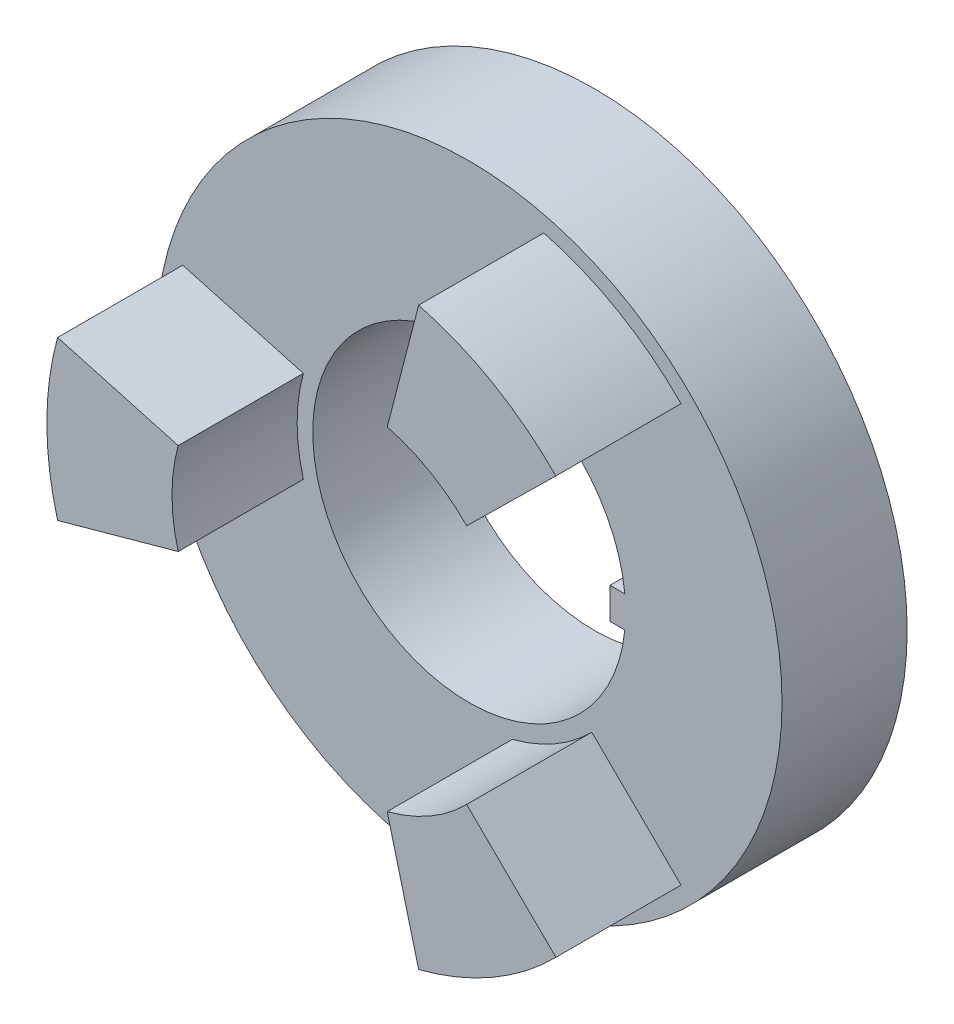
ISO-10303-21;
HEADER;
FILE_DESCRIPTION(('STEP AP214'),'2;1');
FILE_NAME('part.step','',(''),(''),'','','');
FILE_SCHEMA(('AUTOMOTIVE_DESIGN { 1 0 10303 214 1 1 1 1 }'));
ENDSEC;
DATA;
#1=APPLICATION_CONTEXT('core data for automotive mechanical design processes');
#2=APPLICATION_PROTOCOL_DEFINITION('international standard','automotive_design',2000,#1);
#3=PRODUCT_CONTEXT('',#1,'mechanical');
#4=PRODUCT('Part','Part','',(#3));
#5=PRODUCT_RELATED_PRODUCT_CATEGORY('part','',(#4));
#6=PRODUCT_DEFINITION_FORMATION('','',#4);
#7=PRODUCT_DEFINITION_CONTEXT('part definition',#1,'design');
#8=PRODUCT_DEFINITION('design','',#6,#7);
#9=PRODUCT_DEFINITION_SHAPE('','',#8);
#10=(LENGTH_UNIT() NAMED_UNIT(*) SI_UNIT(.MILLI.,.METRE.));
#11=(NAMED_UNIT(*) PLANE_ANGLE_UNIT() SI_UNIT($,.RADIAN.));
#12=(NAMED_UNIT(*) SI_UNIT($,.STERADIAN.) SOLID_ANGLE_UNIT());
#13=UNCERTAINTY_MEASURE_WITH_UNIT(LENGTH_MEASURE(1.E-05),#10,'distance_accuracy_value','');
#14=(GEOMETRIC_REPRESENTATION_CONTEXT(3) GLOBAL_UNCERTAINTY_ASSIGNED_CONTEXT((#13)) GLOBAL_UNIT_ASSIGNED_CONTEXT((#10,
#11,#12)) REPRESENTATION_CONTEXT('',''));
#15=CARTESIAN_POINT('',(0.,0.,0.));
#16=DIRECTION('',(0.,0.,1.));
#17=DIRECTION('',(1.,0.,0.));
#18=AXIS2_PLACEMENT_3D('',#15,#16,#17);
#19=CARTESIAN_POINT('',(0.,0.,4.));
#20=DIRECTION('',(0.,0.,1.));
#21=DIRECTION('',(1.,0.,0.));
#22=AXIS2_PLACEMENT_3D('',#19,#20,#21);
#23=PLANE('',#22);
#24=DIRECTION('',(-1.,0.,0.));
#25=VECTOR('',#24,1.);
#26=CARTESIAN_POINT('',(5.5,-0.499999999999999,4.));
#27=LINE('',#26,#25);
#28=CARTESIAN_POINT('',(4.9749371855331,-0.499999999999999,4.));
#29=VERTEX_POINT('',#28);
#30=CARTESIAN_POINT('',(4.5,-0.499999999999999,4.));
#31=VERTEX_POINT('',#30);
#32=EDGE_CURVE('E156',#29,#31,#27,.T.);
#33=ORIENTED_EDGE('',*,*,#32,.F.);
#34=CARTESIAN_POINT('',(0.,0.,4.));
#35=DIRECTION('',(0.,0.,1.));
#36=DIRECTION('',(1.,0.,0.));
#37=AXIS2_PLACEMENT_3D('',#34,#35,#36);
#38=CIRCLE('',#37,5.);
#39=CARTESIAN_POINT('',(4.9749371855331,0.500000000000001,4.));
#40=VERTEX_POINT('',#39);
#41=EDGE_CURVE('E164',#40,#29,#38,.T.);
#42=ORIENTED_EDGE('',*,*,#41,.F.);
#43=DIRECTION('',(1.,0.,0.));
#44=VECTOR('',#43,1.);
#45=CARTESIAN_POINT('',(5.5,0.500000000000001,4.));
#46=LINE('',#45,#44);
#47=CARTESIAN_POINT('',(4.5,0.500000000000001,4.));
#48=VERTEX_POINT('',#47);
#49=EDGE_CURVE('E150',#48,#40,#46,.T.);
#50=ORIENTED_EDGE('',*,*,#49,.F.);
#51=DIRECTION('',(0.,1.,0.));
#52=VECTOR('',#51,1.);
#53=CARTESIAN_POINT('',(4.5,0.500000000000001,4.));
#54=LINE('',#53,#52);
#55=EDGE_CURVE('E162',#31,#48,#54,.T.);
#56=ORIENTED_EDGE('',*,*,#55,.F.);
#57=EDGE_LOOP('',(#33,#42,#50,#56));
#58=FACE_BOUND('',#57,.T.);
#59=CARTESIAN_POINT('',(0.,0.,4.));
#60=DIRECTION('',(0.,0.,1.));
#61=DIRECTION('',(1.,0.,0.));
#62=AXIS2_PLACEMENT_3D('',#59,#60,#61);
#63=CIRCLE('',#62,5.5);
#64=CARTESIAN_POINT('',(3.92058984626385,3.85732747603526,4.));
#65=VERTEX_POINT('',#64);
#66=CARTESIAN_POINT('',(1.3802486618295,5.32399414270192,4.));
#67=VERTEX_POINT('',#66);
#68=EDGE_CURVE('E177',#65,#67,#63,.T.);
#69=ORIENTED_EDGE('',*,*,#68,.T.);
#70=DIRECTION('',(0.250954302150848,0.967998935036594,0.));
#71=VECTOR('',#70,1.);
#72=CARTESIAN_POINT('',(-3.16741076286094E-13,0.,4.));
#73=LINE('',#72,#71);
#74=CARTESIAN_POINT('',(2.38406587043289,9.1959898828483,4.));
#75=VERTEX_POINT('',#74);
#76=EDGE_CURVE('E183',#67,#75,#73,.T.);
#77=ORIENTED_EDGE('',*,*,#76,.T.);
#78=CARTESIAN_POINT('',(0.,0.,4.));
#79=DIRECTION('',(0.,0.,1.));
#80=DIRECTION('',(1.,0.,0.));
#81=AXIS2_PLACEMENT_3D('',#78,#79,#80);
#82=CIRCLE('',#81,9.5);
#83=CARTESIAN_POINT('',(6.7719279162738,6.66265654951473,4.));
#84=VERTEX_POINT('',#83);
#85=EDGE_CURVE('E193',#84,#75,#82,.T.);
#86=ORIENTED_EDGE('',*,*,#85,.F.);
#87=DIRECTION('',(0.712834517502549,0.701332268369928,0.));
#88=VECTOR('',#87,1.);
#89=CARTESIAN_POINT('',(-4.08479342547263E-13,4.1517863669842E-13,4.));
#90=LINE('',#89,#88);
#91=EDGE_CURVE('E58',#65,#84,#90,.T.);
#92=ORIENTED_EDGE('',*,*,#91,.F.);
#93=EDGE_LOOP('',(#69,#77,#86,#92));
#94=FACE_BOUND('',#93,.T.);
#95=CARTESIAN_POINT('',(0.,0.,4.));
#96=DIRECTION('',(0.,0.,1.));
#97=DIRECTION('',(1.,0.,0.));
#98=AXIS2_PLACEMENT_3D('',#95,#96,#97);
#99=CIRCLE('',#98,5.5);
#100=CARTESIAN_POINT('',(1.38024866183015,-5.3239941427008,4.));
#101=VERTEX_POINT('',#100);
#102=CARTESIAN_POINT('',(3.9205898462645,-3.85732747603413,4.));
#103=VERTEX_POINT('',#102);
#104=EDGE_CURVE('E207',#101,#103,#99,.T.);
#105=ORIENTED_EDGE('',*,*,#104,.T.);
#106=DIRECTION('',(0.712834517502549,-0.701332268369927,0.));
#107=VECTOR('',#106,1.);
#108=CARTESIAN_POINT('',(4.70526837617733E-13,4.78243746070332E-13,4.));
#109=LINE('',#108,#107);
#110=CARTESIAN_POINT('',(6.7719279162747,-6.66265654951384,4.));
#111=VERTEX_POINT('',#110);
#112=EDGE_CURVE('E212',#103,#111,#109,.T.);
#113=ORIENTED_EDGE('',*,*,#112,.T.);
#114=CARTESIAN_POINT('',(0.,0.,4.));
#115=DIRECTION('',(0.,0.,1.));
#116=DIRECTION('',(1.,0.,0.));
#117=AXIS2_PLACEMENT_3D('',#114,#115,#116);
#118=CIRCLE('',#117,9.5);
#119=CARTESIAN_POINT('',(2.38406587043363,-9.1959898828475,4.));
#120=VERTEX_POINT('',#119);
#121=EDGE_CURVE('E224',#120,#111,#118,.T.);
#122=ORIENTED_EDGE('',*,*,#121,.F.);
#123=DIRECTION('',(0.250954302150849,-0.967998935036594,0.));
#124=VECTOR('',#123,1.);
#125=CARTESIAN_POINT('',(5.63165213834055E-13,1.46000918098134E-13,4.));
#126=LINE('',#125,#124);
#127=EDGE_CURVE('E221',#101,#120,#126,.T.);
#128=ORIENTED_EDGE('',*,*,#127,.F.);
#129=EDGE_LOOP('',(#105,#113,#122,#128));
#130=FACE_BOUND('',#129,.T.);
#131=CARTESIAN_POINT('',(0.,0.,4.));
#132=DIRECTION('',(0.,0.,1.));
#133=DIRECTION('',(1.,0.,0.));
#134=AXIS2_PLACEMENT_3D('',#131,#132,#133);
#135=CIRCLE('',#134,5.5);
#136=CARTESIAN_POINT('',(-5.30083850809369,1.46666666666667,4.));
#137=VERTEX_POINT('',#136);
#138=CARTESIAN_POINT('',(-5.30083850809369,-1.46666666666666,4.));
#139=VERTEX_POINT('',#138);
#140=EDGE_CURVE('E239',#137,#139,#135,.T.);
#141=ORIENTED_EDGE('',*,*,#140,.T.);
#142=DIRECTION('',(-0.963788819653398,-0.266666666666666,0.));
#143=VECTOR('',#142,1.);
#144=CARTESIAN_POINT('',(0.,0.,4.));
#145=LINE('',#144,#143);
#146=CARTESIAN_POINT('',(-9.15599378670728,-2.53333333333333,4.));
#147=VERTEX_POINT('',#146);
#148=EDGE_CURVE('E244',#139,#147,#145,.T.);
#149=ORIENTED_EDGE('',*,*,#148,.T.);
#150=CARTESIAN_POINT('',(0.,0.,4.));
#151=DIRECTION('',(0.,0.,1.));
#152=DIRECTION('',(1.,0.,0.));
#153=AXIS2_PLACEMENT_3D('',#150,#151,#152);
#154=CIRCLE('',#153,9.5);
#155=CARTESIAN_POINT('',(-9.15599378670728,2.53333333333333,4.));
#156=VERTEX_POINT('',#155);
#157=EDGE_CURVE('E256',#156,#147,#154,.T.);
#158=ORIENTED_EDGE('',*,*,#157,.F.);
#159=DIRECTION('',(-0.963788819653397,0.266666666666667,0.));
#160=VECTOR('',#159,1.);
#161=CARTESIAN_POINT('',(0.,0.,4.));
#162=LINE('',#161,#160);
#163=EDGE_CURVE('E253',#137,#156,#162,.T.);
#164=ORIENTED_EDGE('',*,*,#163,.F.);
#165=EDGE_LOOP('',(#141,#149,#158,#164));
#166=FACE_BOUND('',#165,.T.);
#167=CARTESIAN_POINT('',(0.,0.,4.));
#168=DIRECTION('',(0.,0.,1.));
#169=DIRECTION('',(1.,0.,0.));
#170=AXIS2_PLACEMENT_3D('',#167,#168,#169);
#171=CIRCLE('',#170,10.);
#172=CARTESIAN_POINT('',(10.,0.,4.));
#173=VERTEX_POINT('',#172);
#174=EDGE_CURVE('E275',#173,#173,#171,.T.);
#175=ORIENTED_EDGE('',*,*,#174,.T.);
#176=EDGE_LOOP('',(#175));
#177=FACE_BOUND('',#176,.T.);
#178=ADVANCED_FACE('F35',(#58,#94,#130,#166,#177),#23,.T.);
#179=CARTESIAN_POINT('',(0.,0.,0.));
#180=DIRECTION('',(0.,0.,1.));
#181=DIRECTION('',(1.,0.,0.));
#182=AXIS2_PLACEMENT_3D('',#179,#180,#181);
#183=PLANE('',#182);
#184=CARTESIAN_POINT('',(0.,0.,0.));
#185=DIRECTION('',(0.,0.,1.));
#186=DIRECTION('',(1.,0.,0.));
#187=AXIS2_PLACEMENT_3D('',#184,#185,#186);
#188=CIRCLE('',#187,10.);
#189=CARTESIAN_POINT('',(10.,0.,0.));
#190=VERTEX_POINT('',#189);
#191=EDGE_CURVE('E273',#190,#190,#188,.T.);
#192=ORIENTED_EDGE('',*,*,#191,.F.);
#193=EDGE_LOOP('',(#192));
#194=FACE_BOUND('',#193,.T.);
#195=CARTESIAN_POINT('',(0.,0.,0.));
#196=DIRECTION('',(0.,0.,1.));
#197=DIRECTION('',(1.,0.,0.));
#198=AXIS2_PLACEMENT_3D('',#195,#196,#197);
#199=CIRCLE('',#198,5.);
#200=CARTESIAN_POINT('',(4.9749371855331,0.500000000000001,0.));
#201=VERTEX_POINT('',#200);
#202=CARTESIAN_POINT('',(4.9749371855331,-0.499999999999999,0.));
#203=VERTEX_POINT('',#202);
#204=EDGE_CURVE('E271',#201,#203,#199,.T.);
#205=ORIENTED_EDGE('',*,*,#204,.T.);
#206=DIRECTION('',(-1.,0.,0.));
#207=VECTOR('',#206,1.);
#208=CARTESIAN_POINT('',(5.5,-0.499999999999999,0.));
#209=LINE('',#208,#207);
#210=CARTESIAN_POINT('',(4.5,-0.499999999999999,0.));
#211=VERTEX_POINT('',#210);
#212=EDGE_CURVE('E169',#203,#211,#209,.T.);
#213=ORIENTED_EDGE('',*,*,#212,.T.);
#214=DIRECTION('',(0.,1.,0.));
#215=VECTOR('',#214,1.);
#216=CARTESIAN_POINT('',(4.5,0.500000000000001,0.));
#217=LINE('',#216,#215);
#218=CARTESIAN_POINT('',(4.5,0.500000000000001,0.));
#219=VERTEX_POINT('',#218);
#220=EDGE_CURVE('E174',#211,#219,#217,.T.);
#221=ORIENTED_EDGE('',*,*,#220,.T.);
#222=DIRECTION('',(1.,0.,0.));
#223=VECTOR('',#222,1.);
#224=CARTESIAN_POINT('',(5.5,0.500000000000001,0.));
#225=LINE('',#224,#223);
#226=EDGE_CURVE('E50',#219,#201,#225,.T.);
#227=ORIENTED_EDGE('',*,*,#226,.T.);
#228=EDGE_LOOP('',(#205,#213,#221,#227));
#229=FACE_BOUND('',#228,.T.);
#230=ADVANCED_FACE('F283',(#194,#229),#183,.F.);
#231=CARTESIAN_POINT('',(0.,0.,4.));
#232=DIRECTION('',(0.,0.,-1.));
#233=DIRECTION('',(-1.,0.,0.));
#234=AXIS2_PLACEMENT_3D('',#231,#232,#233);
#235=CYLINDRICAL_SURFACE('',#234,10.);
#236=ORIENTED_EDGE('',*,*,#174,.F.);
#237=EDGE_LOOP('',(#236));
#238=FACE_BOUND('',#237,.T.);
#239=ORIENTED_EDGE('',*,*,#191,.T.);
#240=EDGE_LOOP('',(#239));
#241=FACE_BOUND('',#240,.T.);
#242=ADVANCED_FACE('F37',(#238,#241),#235,.T.);
#243=CARTESIAN_POINT('',(0.,0.,4.));
#244=DIRECTION('',(0.,0.,-1.));
#245=DIRECTION('',(-1.,0.,0.));
#246=AXIS2_PLACEMENT_3D('',#243,#244,#245);
#247=CYLINDRICAL_SURFACE('',#246,5.);
#248=DIRECTION('',(0.,0.,-1.));
#249=VECTOR('',#248,1.);
#250=CARTESIAN_POINT('',(4.9749371855331,-0.499999999999999,4.));
#251=LINE('',#250,#249);
#252=EDGE_CURVE('E11',#203,#29,#251,.F.);
#253=ORIENTED_EDGE('',*,*,#252,.F.);
#254=ORIENTED_EDGE('',*,*,#204,.F.);
#255=DIRECTION('',(0.,0.,-1.));
#256=VECTOR('',#255,1.);
#257=CARTESIAN_POINT('',(4.9749371855331,0.500000000000001,4.));
#258=LINE('',#257,#256);
#259=EDGE_CURVE('E43',#40,#201,#258,.T.);
#260=ORIENTED_EDGE('',*,*,#259,.F.);
#261=ORIENTED_EDGE('',*,*,#41,.T.);
#262=EDGE_LOOP('',(#253,#254,#260,#261));
#263=FACE_BOUND('',#262,.T.);
#264=ADVANCED_FACE('F282',(#263),#247,.F.);
#265=CARTESIAN_POINT('',(0.,0.,8.));
#266=DIRECTION('',(0.,0.,-1.));
#267=DIRECTION('',(-1.,0.,0.));
#268=AXIS2_PLACEMENT_3D('',#265,#266,#267);
#269=CYLINDRICAL_SURFACE('',#268,5.5);
#270=ORIENTED_EDGE('',*,*,#140,.F.);
#271=DIRECTION('',(0.,0.,-1.));
#272=VECTOR('',#271,1.);
#273=CARTESIAN_POINT('',(-5.30083850809369,1.46666666666667,8.));
#274=LINE('',#273,#272);
#275=CARTESIAN_POINT('',(-5.30083850809369,1.46666666666667,8.));
#276=VERTEX_POINT('',#275);
#277=EDGE_CURVE('E268',#276,#137,#274,.T.);
#278=ORIENTED_EDGE('',*,*,#277,.F.);
#279=CARTESIAN_POINT('',(0.,0.,8.));
#280=DIRECTION('',(0.,0.,1.));
#281=DIRECTION('',(1.,0.,0.));
#282=AXIS2_PLACEMENT_3D('',#279,#280,#281);
#283=CIRCLE('',#282,5.5);
#284=CARTESIAN_POINT('',(-5.30083850809369,-1.46666666666666,8.));
#285=VERTEX_POINT('',#284);
#286=EDGE_CURVE('E240',#276,#285,#283,.T.);
#287=ORIENTED_EDGE('',*,*,#286,.T.);
#288=DIRECTION('',(0.,0.,-1.));
#289=VECTOR('',#288,1.);
#290=CARTESIAN_POINT('',(-5.30083850809369,-1.46666666666666,8.));
#291=LINE('',#290,#289);
#292=EDGE_CURVE('E251',#285,#139,#291,.T.);
#293=ORIENTED_EDGE('',*,*,#292,.T.);
#294=EDGE_LOOP('',(#270,#278,#287,#293));
#295=FACE_BOUND('',#294,.T.);
#296=ADVANCED_FACE('F304',(#295),#269,.F.);
#297=CARTESIAN_POINT('',(0.,0.,8.));
#298=DIRECTION('',(-0.266666666666667,-0.963788819653397,0.));
#299=DIRECTION('',(0.963788819653397,-0.266666666666667,0.));
#300=AXIS2_PLACEMENT_3D('',#297,#298,#299);
#301=PLANE('',#300);
#302=ORIENTED_EDGE('',*,*,#163,.T.);
#303=DIRECTION('',(0.,0.,-1.));
#304=VECTOR('',#303,1.);
#305=CARTESIAN_POINT('',(-9.15599378670728,2.53333333333333,8.));
#306=LINE('',#305,#304);
#307=CARTESIAN_POINT('',(-9.15599378670728,2.53333333333333,8.));
#308=VERTEX_POINT('',#307);
#309=EDGE_CURVE('E265',#308,#156,#306,.T.);
#310=ORIENTED_EDGE('',*,*,#309,.F.);
#311=DIRECTION('',(-0.963788819653397,0.266666666666667,0.));
#312=VECTOR('',#311,1.);
#313=CARTESIAN_POINT('',(0.,0.,8.));
#314=LINE('',#313,#312);
#315=EDGE_CURVE('E243',#276,#308,#314,.T.);
#316=ORIENTED_EDGE('',*,*,#315,.F.);
#317=ORIENTED_EDGE('',*,*,#277,.T.);
#318=EDGE_LOOP('',(#302,#310,#316,#317));
#319=FACE_BOUND('',#318,.T.);
#320=ADVANCED_FACE('F307',(#319),#301,.F.);
#321=CARTESIAN_POINT('',(0.,0.,8.));
#322=DIRECTION('',(0.,0.,-1.));
#323=DIRECTION('',(-1.,0.,0.));
#324=AXIS2_PLACEMENT_3D('',#321,#322,#323);
#325=CYLINDRICAL_SURFACE('',#324,9.5);
#326=ORIENTED_EDGE('',*,*,#157,.T.);
#327=DIRECTION('',(0.,0.,-1.));
#328=VECTOR('',#327,1.);
#329=CARTESIAN_POINT('',(-9.15599378670728,-2.53333333333333,8.));
#330=LINE('',#329,#328);
#331=CARTESIAN_POINT('',(-9.15599378670728,-2.53333333333333,8.));
#332=VERTEX_POINT('',#331);
#333=EDGE_CURVE('E262',#332,#147,#330,.T.);
#334=ORIENTED_EDGE('',*,*,#333,.F.);
#335=CARTESIAN_POINT('',(0.,0.,8.));
#336=DIRECTION('',(0.,0.,1.));
#337=DIRECTION('',(1.,0.,0.));
#338=AXIS2_PLACEMENT_3D('',#335,#336,#337);
#339=CIRCLE('',#338,9.5);
#340=EDGE_CURVE('E246',#308,#332,#339,.T.);
#341=ORIENTED_EDGE('',*,*,#340,.F.);
#342=ORIENTED_EDGE('',*,*,#309,.T.);
#343=EDGE_LOOP('',(#326,#334,#341,#342));
#344=FACE_BOUND('',#343,.T.);
#345=ADVANCED_FACE('F311',(#344),#325,.T.);
#346=CARTESIAN_POINT('',(0.,0.,8.));
#347=DIRECTION('',(0.266666666666666,-0.963788819653398,0.));
#348=DIRECTION('',(0.963788819653398,0.266666666666666,0.));
#349=AXIS2_PLACEMENT_3D('',#346,#347,#348);
#350=PLANE('',#349);
#351=ORIENTED_EDGE('',*,*,#148,.F.);
#352=ORIENTED_EDGE('',*,*,#292,.F.);
#353=DIRECTION('',(-0.963788819653398,-0.266666666666666,0.));
#354=VECTOR('',#353,1.);
#355=CARTESIAN_POINT('',(0.,0.,8.));
#356=LINE('',#355,#354);
#357=EDGE_CURVE('E248',#285,#332,#356,.T.);
#358=ORIENTED_EDGE('',*,*,#357,.T.);
#359=ORIENTED_EDGE('',*,*,#333,.T.);
#360=EDGE_LOOP('',(#351,#352,#358,#359));
#361=FACE_BOUND('',#360,.T.);
#362=ADVANCED_FACE('F315',(#361),#350,.T.);
#363=CARTESIAN_POINT('',(0.,0.,8.));
#364=DIRECTION('',(0.,0.,1.));
#365=DIRECTION('',(1.,0.,0.));
#366=AXIS2_PLACEMENT_3D('',#363,#364,#365);
#367=PLANE('',#366);
#368=ORIENTED_EDGE('',*,*,#286,.F.);
#369=ORIENTED_EDGE('',*,*,#315,.T.);
#370=ORIENTED_EDGE('',*,*,#340,.T.);
#371=ORIENTED_EDGE('',*,*,#357,.F.);
#372=EDGE_LOOP('',(#368,#369,#370,#371));
#373=FACE_BOUND('',#372,.T.);
#374=ADVANCED_FACE('F319',(#373),#367,.T.);
#375=CARTESIAN_POINT('',(0.,0.,8.));
#376=DIRECTION('',(0.,0.,-1.));
#377=DIRECTION('',(-1.,0.,0.));
#378=AXIS2_PLACEMENT_3D('',#375,#376,#377);
#379=CYLINDRICAL_SURFACE('',#378,5.5);
#380=ORIENTED_EDGE('',*,*,#104,.F.);
#381=DIRECTION('',(0.,0.,-1.));
#382=VECTOR('',#381,1.);
#383=CARTESIAN_POINT('',(1.38024866183015,-5.3239941427008,8.));
#384=LINE('',#383,#382);
#385=CARTESIAN_POINT('',(1.38024866183015,-5.3239941427008,8.));
#386=VERTEX_POINT('',#385);
#387=EDGE_CURVE('E236',#386,#101,#384,.T.);
#388=ORIENTED_EDGE('',*,*,#387,.F.);
#389=CARTESIAN_POINT('',(0.,0.,8.));
#390=DIRECTION('',(0.,0.,1.));
#391=DIRECTION('',(1.,0.,0.));
#392=AXIS2_PLACEMENT_3D('',#389,#390,#391);
#393=CIRCLE('',#392,5.5);
#394=CARTESIAN_POINT('',(3.9205898462645,-3.85732747603413,8.));
#395=VERTEX_POINT('',#394);
#396=EDGE_CURVE('E208',#386,#395,#393,.T.);
#397=ORIENTED_EDGE('',*,*,#396,.T.);
#398=DIRECTION('',(0.,0.,-1.));
#399=VECTOR('',#398,1.);
#400=CARTESIAN_POINT('',(3.9205898462645,-3.85732747603413,8.));
#401=LINE('',#400,#399);
#402=EDGE_CURVE('E219',#395,#103,#401,.T.);
#403=ORIENTED_EDGE('',*,*,#402,.T.);
#404=EDGE_LOOP('',(#380,#388,#397,#403));
#405=FACE_BOUND('',#404,.T.);
#406=ADVANCED_FACE('F323',(#405),#379,.F.);
#407=CARTESIAN_POINT('',(5.63165213834055E-13,1.46000918098134E-13,8.));
#408=DIRECTION('',(0.967998935036594,0.250954302150849,0.));
#409=DIRECTION('',(-0.250954302150849,0.967998935036594,0.));
#410=AXIS2_PLACEMENT_3D('',#407,#408,#409);
#411=PLANE('',#410);
#412=ORIENTED_EDGE('',*,*,#127,.T.);
#413=DIRECTION('',(0.,0.,-1.));
#414=VECTOR('',#413,1.);
#415=CARTESIAN_POINT('',(2.38406587043355,-9.19598988284717,8.));
#416=LINE('',#415,#414);
#417=CARTESIAN_POINT('',(2.38406587043355,-9.19598988284717,8.));
#418=VERTEX_POINT('',#417);
#419=EDGE_CURVE('E233',#418,#120,#416,.T.);
#420=ORIENTED_EDGE('',*,*,#419,.F.);
#421=DIRECTION('',(0.250954302150849,-0.967998935036594,0.));
#422=VECTOR('',#421,1.);
#423=CARTESIAN_POINT('',(5.63165213834055E-13,1.46000918098134E-13,8.));
#424=LINE('',#423,#422);
#425=EDGE_CURVE('E211',#386,#418,#424,.T.);
#426=ORIENTED_EDGE('',*,*,#425,.F.);
#427=ORIENTED_EDGE('',*,*,#387,.T.);
#428=EDGE_LOOP('',(#412,#420,#426,#427));
#429=FACE_BOUND('',#428,.T.);
#430=ADVANCED_FACE('F327',(#429),#411,.F.);
#431=CARTESIAN_POINT('',(0.,0.,8.));
#432=DIRECTION('',(0.,0.,-1.));
#433=DIRECTION('',(-1.,0.,0.));
#434=AXIS2_PLACEMENT_3D('',#431,#432,#433);
#435=CYLINDRICAL_SURFACE('',#434,9.5);
#436=ORIENTED_EDGE('',*,*,#121,.T.);
#437=DIRECTION('',(0.,0.,-1.));
#438=VECTOR('',#437,1.);
#439=CARTESIAN_POINT('',(6.7719279162747,-6.66265654951384,8.));
#440=LINE('',#439,#438);
#441=CARTESIAN_POINT('',(6.7719279162747,-6.66265654951384,8.));
#442=VERTEX_POINT('',#441);
#443=EDGE_CURVE('E230',#442,#111,#440,.T.);
#444=ORIENTED_EDGE('',*,*,#443,.F.);
#445=CARTESIAN_POINT('',(0.,0.,8.));
#446=DIRECTION('',(0.,0.,1.));
#447=DIRECTION('',(1.,0.,0.));
#448=AXIS2_PLACEMENT_3D('',#445,#446,#447);
#449=CIRCLE('',#448,9.5);
#450=EDGE_CURVE('E214',#418,#442,#449,.T.);
#451=ORIENTED_EDGE('',*,*,#450,.F.);
#452=ORIENTED_EDGE('',*,*,#419,.T.);
#453=EDGE_LOOP('',(#436,#444,#451,#452));
#454=FACE_BOUND('',#453,.T.);
#455=ADVANCED_FACE('F331',(#454),#435,.T.);
#456=CARTESIAN_POINT('',(4.70526837617733E-13,4.78243746070332E-13,8.));
#457=DIRECTION('',(0.701332268369927,0.712834517502549,0.));
#458=DIRECTION('',(-0.712834517502549,0.701332268369927,0.));
#459=AXIS2_PLACEMENT_3D('',#456,#457,#458);
#460=PLANE('',#459);
#461=ORIENTED_EDGE('',*,*,#112,.F.);
#462=ORIENTED_EDGE('',*,*,#402,.F.);
#463=DIRECTION('',(0.712834517502549,-0.701332268369927,0.));
#464=VECTOR('',#463,1.);
#465=CARTESIAN_POINT('',(4.70526837617733E-13,4.78243746070332E-13,8.));
#466=LINE('',#465,#464);
#467=EDGE_CURVE('E216',#395,#442,#466,.T.);
#468=ORIENTED_EDGE('',*,*,#467,.T.);
#469=ORIENTED_EDGE('',*,*,#443,.T.);
#470=EDGE_LOOP('',(#461,#462,#468,#469));
#471=FACE_BOUND('',#470,.T.);
#472=ADVANCED_FACE('F335',(#471),#460,.T.);
#473=CARTESIAN_POINT('',(0.,0.,8.));
#474=DIRECTION('',(0.,0.,1.));
#475=DIRECTION('',(1.,0.,0.));
#476=AXIS2_PLACEMENT_3D('',#473,#474,#475);
#477=PLANE('',#476);
#478=ORIENTED_EDGE('',*,*,#396,.F.);
#479=ORIENTED_EDGE('',*,*,#425,.T.);
#480=ORIENTED_EDGE('',*,*,#450,.T.);
#481=ORIENTED_EDGE('',*,*,#467,.F.);
#482=EDGE_LOOP('',(#478,#479,#480,#481));
#483=FACE_BOUND('',#482,.T.);
#484=ADVANCED_FACE('F339',(#483),#477,.T.);
#485=CARTESIAN_POINT('',(0.,0.,8.));
#486=DIRECTION('',(0.,0.,-1.));
#487=DIRECTION('',(-1.,0.,0.));
#488=AXIS2_PLACEMENT_3D('',#485,#486,#487);
#489=CYLINDRICAL_SURFACE('',#488,5.5);
#490=ORIENTED_EDGE('',*,*,#68,.F.);
#491=DIRECTION('',(0.,0.,-1.));
#492=VECTOR('',#491,1.);
#493=CARTESIAN_POINT('',(3.92058984626385,3.85732747603526,8.));
#494=LINE('',#493,#492);
#495=CARTESIAN_POINT('',(3.92058984626385,3.85732747603526,8.));
#496=VERTEX_POINT('',#495);
#497=EDGE_CURVE('E205',#496,#65,#494,.T.);
#498=ORIENTED_EDGE('',*,*,#497,.F.);
#499=CARTESIAN_POINT('',(0.,0.,8.));
#500=DIRECTION('',(0.,0.,1.));
#501=DIRECTION('',(1.,0.,0.));
#502=AXIS2_PLACEMENT_3D('',#499,#500,#501);
#503=CIRCLE('',#502,5.5);
#504=CARTESIAN_POINT('',(1.3802486618295,5.32399414270192,8.));
#505=VERTEX_POINT('',#504);
#506=EDGE_CURVE('E179',#496,#505,#503,.T.);
#507=ORIENTED_EDGE('',*,*,#506,.T.);
#508=DIRECTION('',(0.,0.,-1.));
#509=VECTOR('',#508,1.);
#510=CARTESIAN_POINT('',(1.3802486618295,5.32399414270192,8.));
#511=LINE('',#510,#509);
#512=EDGE_CURVE('E190',#505,#67,#511,.T.);
#513=ORIENTED_EDGE('',*,*,#512,.T.);
#514=EDGE_LOOP('',(#490,#498,#507,#513));
#515=FACE_BOUND('',#514,.T.);
#516=ADVANCED_FACE('F343',(#515),#489,.F.);
#517=CARTESIAN_POINT('',(-4.08479342547263E-13,4.1517863669842E-13,8.));
#518=DIRECTION('',(-0.701332268369928,0.712834517502549,0.));
#519=DIRECTION('',(-0.712834517502549,-0.701332268369928,0.));
#520=AXIS2_PLACEMENT_3D('',#517,#518,#519);
#521=PLANE('',#520);
#522=ORIENTED_EDGE('',*,*,#91,.T.);
#523=DIRECTION('',(0.,0.,-1.));
#524=VECTOR('',#523,1.);
#525=CARTESIAN_POINT('',(6.77192791627404,6.66265654951497,8.));
#526=LINE('',#525,#524);
#527=CARTESIAN_POINT('',(6.77192791627404,6.66265654951497,8.));
#528=VERTEX_POINT('',#527);
#529=EDGE_CURVE('E202',#528,#84,#526,.T.);
#530=ORIENTED_EDGE('',*,*,#529,.F.);
#531=DIRECTION('',(0.712834517502549,0.701332268369928,0.));
#532=VECTOR('',#531,1.);
#533=CARTESIAN_POINT('',(-4.08479342547263E-13,4.1517863669842E-13,8.));
#534=LINE('',#533,#532);
#535=EDGE_CURVE('E182',#496,#528,#534,.T.);
#536=ORIENTED_EDGE('',*,*,#535,.F.);
#537=ORIENTED_EDGE('',*,*,#497,.T.);
#538=EDGE_LOOP('',(#522,#530,#536,#537));
#539=FACE_BOUND('',#538,.T.);
#540=ADVANCED_FACE('F347',(#539),#521,.F.);
#541=CARTESIAN_POINT('',(0.,0.,8.));
#542=DIRECTION('',(0.,0.,-1.));
#543=DIRECTION('',(-1.,0.,0.));
#544=AXIS2_PLACEMENT_3D('',#541,#542,#543);
#545=CYLINDRICAL_SURFACE('',#544,9.5);
#546=ORIENTED_EDGE('',*,*,#85,.T.);
#547=DIRECTION('',(0.,0.,-1.));
#548=VECTOR('',#547,1.);
#549=CARTESIAN_POINT('',(2.38406587043289,9.1959898828483,8.));
#550=LINE('',#549,#548);
#551=CARTESIAN_POINT('',(2.38406587043289,9.1959898828483,8.));
#552=VERTEX_POINT('',#551);
#553=EDGE_CURVE('E199',#552,#75,#550,.T.);
#554=ORIENTED_EDGE('',*,*,#553,.F.);
#555=CARTESIAN_POINT('',(0.,0.,8.));
#556=DIRECTION('',(0.,0.,1.));
#557=DIRECTION('',(1.,0.,0.));
#558=AXIS2_PLACEMENT_3D('',#555,#556,#557);
#559=CIRCLE('',#558,9.5);
#560=EDGE_CURVE('E185',#528,#552,#559,.T.);
#561=ORIENTED_EDGE('',*,*,#560,.F.);
#562=ORIENTED_EDGE('',*,*,#529,.T.);
#563=EDGE_LOOP('',(#546,#554,#561,#562));
#564=FACE_BOUND('',#563,.T.);
#565=ADVANCED_FACE('F351',(#564),#545,.T.);
#566=CARTESIAN_POINT('',(-3.16741076286094E-13,0.,8.));
#567=DIRECTION('',(-0.967998935036594,0.250954302150848,0.));
#568=DIRECTION('',(-0.250954302150848,-0.967998935036594,0.));
#569=AXIS2_PLACEMENT_3D('',#566,#567,#568);
#570=PLANE('',#569);
#571=ORIENTED_EDGE('',*,*,#76,.F.);
#572=ORIENTED_EDGE('',*,*,#512,.F.);
#573=DIRECTION('',(0.250954302150848,0.967998935036594,0.));
#574=VECTOR('',#573,1.);
#575=CARTESIAN_POINT('',(-3.16741076286094E-13,0.,8.));
#576=LINE('',#575,#574);
#577=EDGE_CURVE('E187',#505,#552,#576,.T.);
#578=ORIENTED_EDGE('',*,*,#577,.T.);
#579=ORIENTED_EDGE('',*,*,#553,.T.);
#580=EDGE_LOOP('',(#571,#572,#578,#579));
#581=FACE_BOUND('',#580,.T.);
#582=ADVANCED_FACE('F355',(#581),#570,.T.);
#583=CARTESIAN_POINT('',(0.,0.,8.));
#584=DIRECTION('',(0.,0.,1.));
#585=DIRECTION('',(1.,0.,0.));
#586=AXIS2_PLACEMENT_3D('',#583,#584,#585);
#587=PLANE('',#586);
#588=ORIENTED_EDGE('',*,*,#506,.F.);
#589=ORIENTED_EDGE('',*,*,#535,.T.);
#590=ORIENTED_EDGE('',*,*,#560,.T.);
#591=ORIENTED_EDGE('',*,*,#577,.F.);
#592=EDGE_LOOP('',(#588,#589,#590,#591));
#593=FACE_BOUND('',#592,.T.);
#594=ADVANCED_FACE('F293',(#593),#587,.T.);
#595=CARTESIAN_POINT('',(4.5,0.500000000000001,4.));
#596=DIRECTION('',(-1.,0.,0.));
#597=DIRECTION('',(0.,0.,1.));
#598=AXIS2_PLACEMENT_3D('',#595,#596,#597);
#599=PLANE('',#598);
#600=ORIENTED_EDGE('',*,*,#220,.F.);
#601=DIRECTION('',(0.,0.,-1.));
#602=VECTOR('',#601,1.);
#603=CARTESIAN_POINT('',(4.5,-0.499999999999999,4.));
#604=LINE('',#603,#602);
#605=EDGE_CURVE('E155',#31,#211,#604,.T.);
#606=ORIENTED_EDGE('',*,*,#605,.F.);
#607=ORIENTED_EDGE('',*,*,#55,.T.);
#608=DIRECTION('',(0.,0.,-1.));
#609=VECTOR('',#608,1.);
#610=CARTESIAN_POINT('',(4.5,0.500000000000001,4.));
#611=LINE('',#610,#609);
#612=EDGE_CURVE('E147',#48,#219,#611,.T.);
#613=ORIENTED_EDGE('',*,*,#612,.T.);
#614=EDGE_LOOP('',(#600,#606,#607,#613));
#615=FACE_BOUND('',#614,.T.);
#616=ADVANCED_FACE('F167',(#615),#599,.T.);
#617=CARTESIAN_POINT('',(5.5,-0.499999999999999,4.));
#618=DIRECTION('',(0.,-1.,0.));
#619=DIRECTION('',(0.,0.,-1.));
#620=AXIS2_PLACEMENT_3D('',#617,#618,#619);
#621=PLANE('',#620);
#622=ORIENTED_EDGE('',*,*,#212,.F.);
#623=ORIENTED_EDGE('',*,*,#252,.T.);
#624=ORIENTED_EDGE('',*,*,#32,.T.);
#625=ORIENTED_EDGE('',*,*,#605,.T.);
#626=EDGE_LOOP('',(#622,#623,#624,#625));
#627=FACE_BOUND('',#626,.T.);
#628=ADVANCED_FACE('F285',(#627),#621,.T.);
#629=CARTESIAN_POINT('',(5.5,0.500000000000001,4.));
#630=DIRECTION('',(0.,1.,0.));
#631=DIRECTION('',(0.,0.,1.));
#632=AXIS2_PLACEMENT_3D('',#629,#630,#631);
#633=PLANE('',#632);
#634=ORIENTED_EDGE('',*,*,#49,.T.);
#635=ORIENTED_EDGE('',*,*,#259,.T.);
#636=ORIENTED_EDGE('',*,*,#226,.F.);
#637=ORIENTED_EDGE('',*,*,#612,.F.);
#638=EDGE_LOOP('',(#634,#635,#636,#637));
#639=FACE_BOUND('',#638,.T.);
#640=ADVANCED_FACE('F149',(#639),#633,.T.);
#641=CLOSED_SHELL('',(#178,#230,#242,#264,#296,#320,#345,#362,#374,#406,#430,#455,#472,#484,
#516,#540,#565,#582,#594,#616,#628,#640));
#642=MANIFOLD_SOLID_BREP('B2',#641);
#643=ADVANCED_BREP_SHAPE_REPRESENTATION('',(#18,#642),#14);
#644=SHAPE_DEFINITION_REPRESENTATION(#9,#643);
ENDSEC;
END-ISO-10303-21;
